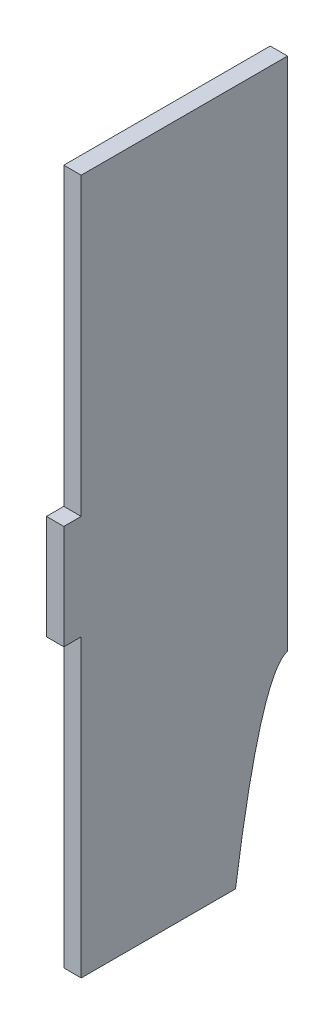
ISO-10303-21;
HEADER;
FILE_DESCRIPTION(('STEP AP214'),'2;1');
FILE_NAME('part.step','',(''),(''),'','','');
FILE_SCHEMA(('AUTOMOTIVE_DESIGN { 1 0 10303 214 1 1 1 1 }'));
ENDSEC;
DATA;
#1=APPLICATION_CONTEXT('core data for automotive mechanical design processes');
#2=APPLICATION_PROTOCOL_DEFINITION('international standard','automotive_design',2000,#1);
#3=PRODUCT_CONTEXT('',#1,'mechanical');
#4=PRODUCT('Part','Part','',(#3));
#5=PRODUCT_RELATED_PRODUCT_CATEGORY('part','',(#4));
#6=PRODUCT_DEFINITION_FORMATION('','',#4);
#7=PRODUCT_DEFINITION_CONTEXT('part definition',#1,'design');
#8=PRODUCT_DEFINITION('design','',#6,#7);
#9=PRODUCT_DEFINITION_SHAPE('','',#8);
#10=(LENGTH_UNIT() NAMED_UNIT(*) SI_UNIT(.MILLI.,.METRE.));
#11=(NAMED_UNIT(*) PLANE_ANGLE_UNIT() SI_UNIT($,.RADIAN.));
#12=(NAMED_UNIT(*) SI_UNIT($,.STERADIAN.) SOLID_ANGLE_UNIT());
#13=UNCERTAINTY_MEASURE_WITH_UNIT(LENGTH_MEASURE(1.E-05),#10,'distance_accuracy_value','');
#14=(GEOMETRIC_REPRESENTATION_CONTEXT(3) GLOBAL_UNCERTAINTY_ASSIGNED_CONTEXT((#13)) GLOBAL_UNIT_ASSIGNED_CONTEXT((#10,
#11,#12)) REPRESENTATION_CONTEXT('',''));
#15=CARTESIAN_POINT('',(0.,0.,0.));
#16=DIRECTION('',(0.,0.,1.));
#17=DIRECTION('',(1.,0.,0.));
#18=AXIS2_PLACEMENT_3D('',#15,#16,#17);
#19=CARTESIAN_POINT('',(0.,31.75,-6.14934));
#20=DIRECTION('',(0.,0.,-1.));
#21=DIRECTION('',(0.,-1.,0.));
#22=AXIS2_PLACEMENT_3D('',#19,#20,#21);
#23=PLANE('',#22);
#24=DIRECTION('',(0.,-1.,0.));
#25=VECTOR('',#24,1.);
#26=CARTESIAN_POINT('',(0.,31.75,-6.14934));
#27=LINE('',#26,#25);
#28=CARTESIAN_POINT('',(0.,31.75,-6.14934));
#29=VERTEX_POINT('',#28);
#30=CARTESIAN_POINT('',(0.,11.3679169744565,-6.14934000000007));
#31=VERTEX_POINT('',#30);
#32=EDGE_CURVE('E51',#29,#31,#27,.T.);
#33=ORIENTED_EDGE('',*,*,#32,.F.);
#34=DIRECTION('',(1.,0.,0.));
#35=VECTOR('',#34,1.);
#36=CARTESIAN_POINT('',(0.,31.75,-6.14934));
#37=LINE('',#36,#35);
#38=CARTESIAN_POINT('',(1.5875,31.75,-6.14934));
#39=VERTEX_POINT('',#38);
#40=EDGE_CURVE('E132',#29,#39,#37,.T.);
#41=ORIENTED_EDGE('',*,*,#40,.T.);
#42=DIRECTION('',(0.,-1.,0.));
#43=VECTOR('',#42,1.);
#44=CARTESIAN_POINT('',(1.5875,31.75,-6.14934));
#45=LINE('',#44,#43);
#46=CARTESIAN_POINT('',(1.5874999999995,-15.3304562621885,-6.14934000000003));
#47=VERTEX_POINT('',#46);
#48=EDGE_CURVE('E118',#39,#47,#45,.T.);
#49=ORIENTED_EDGE('',*,*,#48,.T.);
#50=DIRECTION('',(0.059355716435348,-0.998236895193945,0.));
#51=VECTOR('',#50,1.);
#52=CARTESIAN_POINT('',(-33.1302571277907,568.548370659077,-6.14934000000007));
#53=LINE('',#52,#51);
#54=EDGE_CURVE('E124',#31,#47,#53,.T.);
#55=ORIENTED_EDGE('',*,*,#54,.F.);
#56=EDGE_LOOP('',(#33,#41,#49,#55));
#57=FACE_BOUND('',#56,.T.);
#58=ADVANCED_FACE('F47',(#57),#23,.T.);
#59=CARTESIAN_POINT('',(1.5875,0.,0.));
#60=DIRECTION('',(-1.,0.,0.));
#61=DIRECTION('',(0.,0.,-1.));
#62=AXIS2_PLACEMENT_3D('',#59,#60,#61);
#63=PLANE('',#62);
#64=CARTESIAN_POINT('',(1.5875,-235.687679664261,-6.34999999999919));
#65=DIRECTION('',(1.,0.,0.));
#66=DIRECTION('',(0.,-1.,0.));
#67=AXIS2_PLACEMENT_3D('',#64,#65,#66);
#68=ELLIPSE('',#67,220.383154068206,13.081);
#69=CARTESIAN_POINT('',(1.5875,-31.75,-1.39169849007386));
#70=VERTEX_POINT('',#69);
#71=EDGE_CURVE('E11',#70,#47,#68,.F.);
#72=ORIENTED_EDGE('',*,*,#71,.T.);
#73=ORIENTED_EDGE('',*,*,#48,.F.);
#74=DIRECTION('',(0.,0.,-1.));
#75=VECTOR('',#74,1.);
#76=CARTESIAN_POINT('',(1.5875,31.75,-12.7));
#77=LINE('',#76,#75);
#78=CARTESIAN_POINT('',(1.5875,31.75,12.7));
#79=VERTEX_POINT('',#78);
#80=EDGE_CURVE('E133',#79,#39,#77,.T.);
#81=ORIENTED_EDGE('',*,*,#80,.F.);
#82=DIRECTION('',(0.,1.,0.));
#83=VECTOR('',#82,1.);
#84=CARTESIAN_POINT('',(1.5875,-31.75,12.7));
#85=LINE('',#84,#83);
#86=CARTESIAN_POINT('',(1.5875,4.7625,12.7));
#87=VERTEX_POINT('',#86);
#88=EDGE_CURVE('E137',#87,#79,#85,.T.);
#89=ORIENTED_EDGE('',*,*,#88,.F.);
#90=DIRECTION('',(0.,0.,1.));
#91=VECTOR('',#90,1.);
#92=CARTESIAN_POINT('',(1.5875,4.7625,12.7));
#93=LINE('',#92,#91);
#94=CARTESIAN_POINT('',(1.5875,4.7625,14.2875));
#95=VERTEX_POINT('',#94);
#96=EDGE_CURVE('E168',#87,#95,#93,.T.);
#97=ORIENTED_EDGE('',*,*,#96,.T.);
#98=DIRECTION('',(0.,-1.,0.));
#99=VECTOR('',#98,1.);
#100=CARTESIAN_POINT('',(1.5875,4.7625,14.2875));
#101=LINE('',#100,#99);
#102=CARTESIAN_POINT('',(1.5875,-4.7625,14.2875));
#103=VERTEX_POINT('',#102);
#104=EDGE_CURVE('E171',#95,#103,#101,.T.);
#105=ORIENTED_EDGE('',*,*,#104,.T.);
#106=DIRECTION('',(0.,0.,1.));
#107=VECTOR('',#106,1.);
#108=CARTESIAN_POINT('',(1.5875,-4.7625,12.7));
#109=LINE('',#108,#107);
#110=CARTESIAN_POINT('',(1.5875,-4.7625,12.7));
#111=VERTEX_POINT('',#110);
#112=EDGE_CURVE('E165',#111,#103,#109,.T.);
#113=ORIENTED_EDGE('',*,*,#112,.F.);
#114=CARTESIAN_POINT('',(1.5875,-31.75,12.7));
#115=VERTEX_POINT('',#114);
#116=EDGE_CURVE('E161',#115,#111,#85,.T.);
#117=ORIENTED_EDGE('',*,*,#116,.F.);
#118=DIRECTION('',(0.,0.,1.));
#119=VECTOR('',#118,1.);
#120=CARTESIAN_POINT('',(1.5875,-31.75,-12.7));
#121=LINE('',#120,#119);
#122=EDGE_CURVE('E122',#70,#115,#121,.T.);
#123=ORIENTED_EDGE('',*,*,#122,.F.);
#124=EDGE_LOOP('',(#72,#73,#81,#89,#97,#105,#113,#117,#123));
#125=FACE_BOUND('',#124,.T.);
#126=ADVANCED_FACE('F115',(#125),#63,.F.);
#127=CARTESIAN_POINT('',(0.,0.,0.));
#128=DIRECTION('',(-1.,0.,0.));
#129=DIRECTION('',(0.,0.,-1.));
#130=AXIS2_PLACEMENT_3D('',#127,#128,#129);
#131=PLANE('',#130);
#132=DIRECTION('',(0.,0.,1.));
#133=VECTOR('',#132,1.);
#134=CARTESIAN_POINT('',(0.,-31.75,-12.7));
#135=LINE('',#134,#133);
#136=CARTESIAN_POINT('',(0.,-31.75,1.42423102616017));
#137=VERTEX_POINT('',#136);
#138=CARTESIAN_POINT('',(0.,-31.75,12.7));
#139=VERTEX_POINT('',#138);
#140=EDGE_CURVE('E143',#137,#139,#135,.T.);
#141=ORIENTED_EDGE('',*,*,#140,.T.);
#142=DIRECTION('',(0.,1.,0.));
#143=VECTOR('',#142,1.);
#144=CARTESIAN_POINT('',(0.,-31.75,12.7));
#145=LINE('',#144,#143);
#146=CARTESIAN_POINT('',(0.,-4.7625,12.7));
#147=VERTEX_POINT('',#146);
#148=EDGE_CURVE('E151',#139,#147,#145,.T.);
#149=ORIENTED_EDGE('',*,*,#148,.T.);
#150=DIRECTION('',(0.,0.,1.));
#151=VECTOR('',#150,1.);
#152=CARTESIAN_POINT('',(0.,-4.7625,12.7));
#153=LINE('',#152,#151);
#154=CARTESIAN_POINT('',(0.,-4.7625,14.2875));
#155=VERTEX_POINT('',#154);
#156=EDGE_CURVE('E169',#147,#155,#153,.T.);
#157=ORIENTED_EDGE('',*,*,#156,.T.);
#158=DIRECTION('',(0.,-1.,0.));
#159=VECTOR('',#158,1.);
#160=CARTESIAN_POINT('',(0.,4.7625,14.2875));
#161=LINE('',#160,#159);
#162=CARTESIAN_POINT('',(0.,4.7625,14.2875));
#163=VERTEX_POINT('',#162);
#164=EDGE_CURVE('E183',#163,#155,#161,.T.);
#165=ORIENTED_EDGE('',*,*,#164,.F.);
#166=DIRECTION('',(0.,0.,1.));
#167=VECTOR('',#166,1.);
#168=CARTESIAN_POINT('',(0.,4.7625,12.7));
#169=LINE('',#168,#167);
#170=CARTESIAN_POINT('',(0.,4.7625,12.7));
#171=VERTEX_POINT('',#170);
#172=EDGE_CURVE('E135',#171,#163,#169,.T.);
#173=ORIENTED_EDGE('',*,*,#172,.F.);
#174=CARTESIAN_POINT('',(0.,31.75,12.7));
#175=VERTEX_POINT('',#174);
#176=EDGE_CURVE('E145',#171,#175,#145,.T.);
#177=ORIENTED_EDGE('',*,*,#176,.T.);
#178=DIRECTION('',(0.,0.,-1.));
#179=VECTOR('',#178,1.);
#180=CARTESIAN_POINT('',(0.,31.75,-12.7));
#181=LINE('',#180,#179);
#182=EDGE_CURVE('E146',#175,#29,#181,.T.);
#183=ORIENTED_EDGE('',*,*,#182,.T.);
#184=ORIENTED_EDGE('',*,*,#32,.T.);
#185=CARTESIAN_POINT('',(0.,-208.989306427599,-6.34999999999919));
#186=DIRECTION('',(1.,0.,0.));
#187=DIRECTION('',(0.,-1.,0.));
#188=AXIS2_PLACEMENT_3D('',#185,#186,#187);
#189=ELLIPSE('',#188,220.383154068206,13.081);
#190=EDGE_CURVE('E126',#137,#31,#189,.F.);
#191=ORIENTED_EDGE('',*,*,#190,.F.);
#192=EDGE_LOOP('',(#141,#149,#157,#165,#173,#177,#183,#184,#191));
#193=FACE_BOUND('',#192,.T.);
#194=ADVANCED_FACE('F49',(#193),#131,.T.);
#195=CARTESIAN_POINT('',(1.5875,31.75,-12.7));
#196=DIRECTION('',(0.,-1.,0.));
#197=DIRECTION('',(0.,0.,1.));
#198=AXIS2_PLACEMENT_3D('',#195,#196,#197);
#199=PLANE('',#198);
#200=ORIENTED_EDGE('',*,*,#40,.F.);
#201=ORIENTED_EDGE('',*,*,#182,.F.);
#202=DIRECTION('',(-1.,0.,0.));
#203=VECTOR('',#202,1.);
#204=CARTESIAN_POINT('',(1.5875,31.75,12.7));
#205=LINE('',#204,#203);
#206=EDGE_CURVE('E153',#79,#175,#205,.T.);
#207=ORIENTED_EDGE('',*,*,#206,.F.);
#208=ORIENTED_EDGE('',*,*,#80,.T.);
#209=EDGE_LOOP('',(#200,#201,#207,#208));
#210=FACE_BOUND('',#209,.T.);
#211=ADVANCED_FACE('F194',(#210),#199,.F.);
#212=CARTESIAN_POINT('',(1.5875,-31.75,-12.7));
#213=DIRECTION('',(0.,1.,0.));
#214=DIRECTION('',(0.,0.,-1.));
#215=AXIS2_PLACEMENT_3D('',#212,#213,#214);
#216=PLANE('',#215);
#217=CARTESIAN_POINT('',(-10.5387469288744,-31.7499999999999,-6.34999999999919));
#218=DIRECTION('',(0.,-1.,0.));
#219=DIRECTION('',(1.,0.,0.));
#220=AXIS2_PLACEMENT_3D('',#217,#218,#219);
#221=ELLIPSE('',#220,13.1041039085803,13.081);
#222=EDGE_CURVE('E57',#137,#70,#221,.F.);
#223=ORIENTED_EDGE('',*,*,#222,.T.);
#224=ORIENTED_EDGE('',*,*,#122,.T.);
#225=DIRECTION('',(-1.,0.,0.));
#226=VECTOR('',#225,1.);
#227=CARTESIAN_POINT('',(1.5875,-31.75,12.7));
#228=LINE('',#227,#226);
#229=EDGE_CURVE('E158',#115,#139,#228,.T.);
#230=ORIENTED_EDGE('',*,*,#229,.T.);
#231=ORIENTED_EDGE('',*,*,#140,.F.);
#232=EDGE_LOOP('',(#223,#224,#230,#231));
#233=FACE_BOUND('',#232,.T.);
#234=ADVANCED_FACE('F190',(#233),#216,.F.);
#235=CARTESIAN_POINT('',(1.5875,-31.75,12.7));
#236=DIRECTION('',(0.,0.,-1.));
#237=DIRECTION('',(1.,0.,0.));
#238=AXIS2_PLACEMENT_3D('',#235,#236,#237);
#239=PLANE('',#238);
#240=DIRECTION('',(1.,0.,0.));
#241=VECTOR('',#240,1.);
#242=CARTESIAN_POINT('',(0.,4.7625,12.7));
#243=LINE('',#242,#241);
#244=EDGE_CURVE('E172',#171,#87,#243,.T.);
#245=ORIENTED_EDGE('',*,*,#244,.T.);
#246=ORIENTED_EDGE('',*,*,#88,.T.);
#247=ORIENTED_EDGE('',*,*,#206,.T.);
#248=ORIENTED_EDGE('',*,*,#176,.F.);
#249=EDGE_LOOP('',(#245,#246,#247,#248));
#250=FACE_BOUND('',#249,.T.);
#251=ADVANCED_FACE('F209',(#250),#239,.F.);
#252=ORIENTED_EDGE('',*,*,#148,.F.);
#253=ORIENTED_EDGE('',*,*,#229,.F.);
#254=ORIENTED_EDGE('',*,*,#116,.T.);
#255=DIRECTION('',(1.,0.,0.));
#256=VECTOR('',#255,1.);
#257=CARTESIAN_POINT('',(0.,-4.7625,12.7));
#258=LINE('',#257,#256);
#259=EDGE_CURVE('E160',#147,#111,#258,.T.);
#260=ORIENTED_EDGE('',*,*,#259,.F.);
#261=EDGE_LOOP('',(#252,#253,#254,#260));
#262=FACE_BOUND('',#261,.T.);
#263=ADVANCED_FACE('F192',(#262),#239,.F.);
#264=CARTESIAN_POINT('',(0.,-4.7625,12.7));
#265=DIRECTION('',(0.,-1.,0.));
#266=DIRECTION('',(0.,0.,1.));
#267=AXIS2_PLACEMENT_3D('',#264,#265,#266);
#268=PLANE('',#267);
#269=ORIENTED_EDGE('',*,*,#112,.T.);
#270=DIRECTION('',(1.,0.,0.));
#271=VECTOR('',#270,1.);
#272=CARTESIAN_POINT('',(0.,-4.7625,14.2875));
#273=LINE('',#272,#271);
#274=EDGE_CURVE('E166',#155,#103,#273,.T.);
#275=ORIENTED_EDGE('',*,*,#274,.F.);
#276=ORIENTED_EDGE('',*,*,#156,.F.);
#277=ORIENTED_EDGE('',*,*,#259,.T.);
#278=EDGE_LOOP('',(#269,#275,#276,#277));
#279=FACE_BOUND('',#278,.T.);
#280=ADVANCED_FACE('F218',(#279),#268,.T.);
#281=CARTESIAN_POINT('',(0.,4.7625,12.7));
#282=DIRECTION('',(0.,-1.,0.));
#283=DIRECTION('',(0.,0.,1.));
#284=AXIS2_PLACEMENT_3D('',#281,#282,#283);
#285=PLANE('',#284);
#286=ORIENTED_EDGE('',*,*,#96,.F.);
#287=ORIENTED_EDGE('',*,*,#244,.F.);
#288=ORIENTED_EDGE('',*,*,#172,.T.);
#289=DIRECTION('',(1.,0.,0.));
#290=VECTOR('',#289,1.);
#291=CARTESIAN_POINT('',(0.,4.7625,14.2875));
#292=LINE('',#291,#290);
#293=EDGE_CURVE('E142',#163,#95,#292,.T.);
#294=ORIENTED_EDGE('',*,*,#293,.T.);
#295=EDGE_LOOP('',(#286,#287,#288,#294));
#296=FACE_BOUND('',#295,.T.);
#297=ADVANCED_FACE('F222',(#296),#285,.F.);
#298=CARTESIAN_POINT('',(0.,4.7625,14.2875));
#299=DIRECTION('',(0.,0.,-1.));
#300=DIRECTION('',(1.,0.,0.));
#301=AXIS2_PLACEMENT_3D('',#298,#299,#300);
#302=PLANE('',#301);
#303=ORIENTED_EDGE('',*,*,#104,.F.);
#304=ORIENTED_EDGE('',*,*,#293,.F.);
#305=ORIENTED_EDGE('',*,*,#164,.T.);
#306=ORIENTED_EDGE('',*,*,#274,.T.);
#307=EDGE_LOOP('',(#303,#304,#305,#306));
#308=FACE_BOUND('',#307,.T.);
#309=ADVANCED_FACE('F224',(#308),#302,.F.);
#310=CARTESIAN_POINT('',(-46.186657534209,567.772029888744,-6.34999999999919));
#311=DIRECTION('',(0.059355716435348,-0.998236895193945,0.));
#312=DIRECTION('',(0.,0.,-1.));
#313=AXIS2_PLACEMENT_3D('',#310,#311,#312);
#314=CYLINDRICAL_SURFACE('',#313,13.081);
#315=ORIENTED_EDGE('',*,*,#222,.F.);
#316=ORIENTED_EDGE('',*,*,#190,.T.);
#317=ORIENTED_EDGE('',*,*,#54,.T.);
#318=ORIENTED_EDGE('',*,*,#71,.F.);
#319=EDGE_LOOP('',(#315,#316,#317,#318));
#320=FACE_BOUND('',#319,.T.);
#321=ADVANCED_FACE('F125',(#320),#314,.F.);
#322=CLOSED_SHELL('',(#58,#126,#194,#211,#234,#251,#263,#280,#297,#309,#321));
#323=MANIFOLD_SOLID_BREP('B2',#322);
#324=ADVANCED_BREP_SHAPE_REPRESENTATION('',(#18,#323),#14);
#325=SHAPE_DEFINITION_REPRESENTATION(#9,#324);
ENDSEC;
END-ISO-10303-21;
